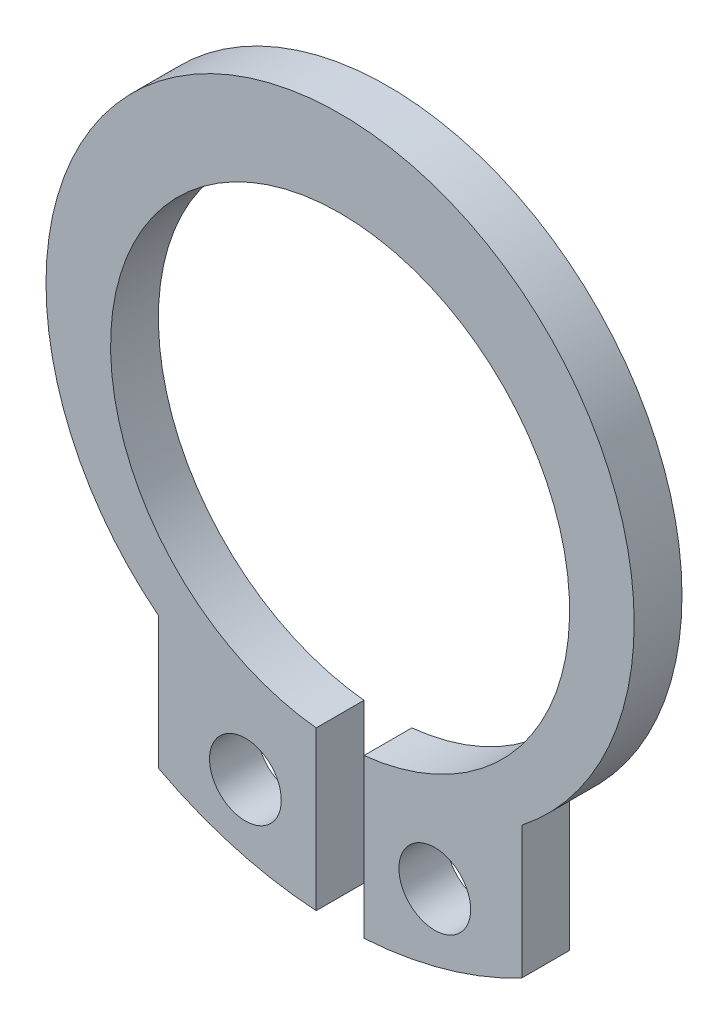
ISO-10303-21;
HEADER;
FILE_DESCRIPTION(('STEP AP214'),'2;1');
FILE_NAME('part.step','',(''),(''),'','','');
FILE_SCHEMA(('AUTOMOTIVE_DESIGN { 1 0 10303 214 1 1 1 1 }'));
ENDSEC;
DATA;
#1=APPLICATION_CONTEXT('core data for automotive mechanical design processes');
#2=APPLICATION_PROTOCOL_DEFINITION('international standard','automotive_design',2000,#1);
#3=PRODUCT_CONTEXT('',#1,'mechanical');
#4=PRODUCT('Part','Part','',(#3));
#5=PRODUCT_RELATED_PRODUCT_CATEGORY('part','',(#4));
#6=PRODUCT_DEFINITION_FORMATION('','',#4);
#7=PRODUCT_DEFINITION_CONTEXT('part definition',#1,'design');
#8=PRODUCT_DEFINITION('design','',#6,#7);
#9=PRODUCT_DEFINITION_SHAPE('','',#8);
#10=(LENGTH_UNIT() NAMED_UNIT(*) SI_UNIT(.MILLI.,.METRE.));
#11=(NAMED_UNIT(*) PLANE_ANGLE_UNIT() SI_UNIT($,.RADIAN.));
#12=(NAMED_UNIT(*) SI_UNIT($,.STERADIAN.) SOLID_ANGLE_UNIT());
#13=UNCERTAINTY_MEASURE_WITH_UNIT(LENGTH_MEASURE(1.E-05),#10,'distance_accuracy_value','');
#14=(GEOMETRIC_REPRESENTATION_CONTEXT(3) GLOBAL_UNCERTAINTY_ASSIGNED_CONTEXT((#13)) GLOBAL_UNIT_ASSIGNED_CONTEXT((#10,
#11,#12)) REPRESENTATION_CONTEXT('',''));
#15=CARTESIAN_POINT('',(0.,0.,0.));
#16=DIRECTION('',(0.,0.,1.));
#17=DIRECTION('',(1.,0.,0.));
#18=AXIS2_PLACEMENT_3D('',#15,#16,#17);
#19=CARTESIAN_POINT('',(-0.5,-8.0845531725631,12.5));
#20=DIRECTION('',(-1.,0.,0.));
#21=DIRECTION('',(0.,-1.,0.));
#22=AXIS2_PLACEMENT_3D('',#19,#20,#21);
#23=PLANE('',#22);
#24=DIRECTION('',(0.,1.,0.));
#25=VECTOR('',#24,1.);
#26=CARTESIAN_POINT('',(-0.5,-8.0845531725631,11.5));
#27=LINE('',#26,#25);
#28=CARTESIAN_POINT('',(-0.500000000000007,-8.0845531725631,11.5));
#29=VERTEX_POINT('',#28);
#30=CARTESIAN_POINT('',(-0.5,-4.773887304912,11.5));
#31=VERTEX_POINT('',#30);
#32=EDGE_CURVE('E103',#29,#31,#27,.T.);
#33=ORIENTED_EDGE('',*,*,#32,.T.);
#34=DIRECTION('',(0.,0.,-1.));
#35=VECTOR('',#34,1.);
#36=CARTESIAN_POINT('',(-0.5,-4.773887304912,12.5));
#37=LINE('',#36,#35);
#38=CARTESIAN_POINT('',(-0.5,-4.773887304912,12.5));
#39=VERTEX_POINT('',#38);
#40=EDGE_CURVE('E11',#39,#31,#37,.T.);
#41=ORIENTED_EDGE('',*,*,#40,.F.);
#42=DIRECTION('',(0.,1.,0.));
#43=VECTOR('',#42,1.);
#44=CARTESIAN_POINT('',(-0.5,-8.0845531725631,12.5));
#45=LINE('',#44,#43);
#46=CARTESIAN_POINT('',(-0.500000000000007,-8.0845531725631,12.5));
#47=VERTEX_POINT('',#46);
#48=EDGE_CURVE('E133',#47,#39,#45,.T.);
#49=ORIENTED_EDGE('',*,*,#48,.F.);
#50=DIRECTION('',(0.,0.,-1.));
#51=VECTOR('',#50,1.);
#52=CARTESIAN_POINT('',(-0.500000000000007,-8.0845531725631,12.5));
#53=LINE('',#52,#51);
#54=EDGE_CURVE('E155',#47,#29,#53,.T.);
#55=ORIENTED_EDGE('',*,*,#54,.T.);
#56=EDGE_LOOP('',(#33,#41,#49,#55));
#57=FACE_BOUND('',#56,.T.);
#58=ADVANCED_FACE('F16',(#57),#23,.F.);
#59=CARTESIAN_POINT('',(0.,0.,12.5));
#60=DIRECTION('',(0.,0.,-1.));
#61=DIRECTION('',(-1.,0.,0.));
#62=AXIS2_PLACEMENT_3D('',#59,#60,#61);
#63=CYLINDRICAL_SURFACE('',#62,4.8);
#64=CARTESIAN_POINT('',(0.,0.,11.5));
#65=DIRECTION('',(0.,0.,1.));
#66=DIRECTION('',(1.,0.,0.));
#67=AXIS2_PLACEMENT_3D('',#64,#65,#66);
#68=CIRCLE('',#67,4.8);
#69=CARTESIAN_POINT('',(0.5,-4.77388730491201,11.5));
#70=VERTEX_POINT('',#69);
#71=EDGE_CURVE('E96',#70,#31,#68,.T.);
#72=ORIENTED_EDGE('',*,*,#71,.F.);
#73=DIRECTION('',(0.,0.,-1.));
#74=VECTOR('',#73,1.);
#75=CARTESIAN_POINT('',(0.5,-4.77388730491201,12.5));
#76=LINE('',#75,#74);
#77=CARTESIAN_POINT('',(0.5,-4.77388730491201,12.5));
#78=VERTEX_POINT('',#77);
#79=EDGE_CURVE('E25',#78,#70,#76,.T.);
#80=ORIENTED_EDGE('',*,*,#79,.F.);
#81=CARTESIAN_POINT('',(0.,0.,12.5));
#82=DIRECTION('',(0.,0.,1.));
#83=DIRECTION('',(1.,0.,0.));
#84=AXIS2_PLACEMENT_3D('',#81,#82,#83);
#85=CIRCLE('',#84,4.8);
#86=EDGE_CURVE('E137',#78,#39,#85,.T.);
#87=ORIENTED_EDGE('',*,*,#86,.T.);
#88=ORIENTED_EDGE('',*,*,#40,.T.);
#89=EDGE_LOOP('',(#72,#80,#87,#88));
#90=FACE_BOUND('',#89,.T.);
#91=ADVANCED_FACE('F97',(#90),#63,.F.);
#92=CARTESIAN_POINT('',(0.5,-8.0845531725631,12.5));
#93=DIRECTION('',(-1.,0.,0.));
#94=DIRECTION('',(0.,-1.,0.));
#95=AXIS2_PLACEMENT_3D('',#92,#93,#94);
#96=PLANE('',#95);
#97=DIRECTION('',(0.,1.,0.));
#98=VECTOR('',#97,1.);
#99=CARTESIAN_POINT('',(0.5,-8.0845531725631,11.5));
#100=LINE('',#99,#98);
#101=CARTESIAN_POINT('',(0.5,-8.0845531725631,11.5));
#102=VERTEX_POINT('',#101);
#103=EDGE_CURVE('E86',#102,#70,#100,.T.);
#104=ORIENTED_EDGE('',*,*,#103,.F.);
#105=DIRECTION('',(0.,0.,-1.));
#106=VECTOR('',#105,1.);
#107=CARTESIAN_POINT('',(0.5,-8.0845531725631,12.5));
#108=LINE('',#107,#106);
#109=CARTESIAN_POINT('',(0.5,-8.0845531725631,12.5));
#110=VERTEX_POINT('',#109);
#111=EDGE_CURVE('E93',#110,#102,#108,.T.);
#112=ORIENTED_EDGE('',*,*,#111,.F.);
#113=DIRECTION('',(0.,1.,0.));
#114=VECTOR('',#113,1.);
#115=CARTESIAN_POINT('',(0.5,-8.0845531725631,12.5));
#116=LINE('',#115,#114);
#117=EDGE_CURVE('E88',#110,#78,#116,.T.);
#118=ORIENTED_EDGE('',*,*,#117,.T.);
#119=ORIENTED_EDGE('',*,*,#79,.T.);
#120=EDGE_LOOP('',(#104,#112,#118,#119));
#121=FACE_BOUND('',#120,.T.);
#122=ADVANCED_FACE('F84',(#121),#96,.T.);
#123=CARTESIAN_POINT('',(0.,0.,12.5));
#124=DIRECTION('',(0.,0.,-1.));
#125=DIRECTION('',(-1.,0.,0.));
#126=AXIS2_PLACEMENT_3D('',#123,#124,#125);
#127=CYLINDRICAL_SURFACE('',#126,8.1);
#128=CARTESIAN_POINT('',(0.,0.,11.5));
#129=DIRECTION('',(0.,0.,1.));
#130=DIRECTION('',(1.,0.,0.));
#131=AXIS2_PLACEMENT_3D('',#128,#129,#130);
#132=CIRCLE('',#131,8.1);
#133=CARTESIAN_POINT('',(3.8,-7.15332090710322,11.5));
#134=VERTEX_POINT('',#133);
#135=EDGE_CURVE('E108',#102,#134,#132,.T.);
#136=ORIENTED_EDGE('',*,*,#135,.T.);
#137=DIRECTION('',(0.,0.,-1.));
#138=VECTOR('',#137,1.);
#139=CARTESIAN_POINT('',(3.8,-7.15332090710322,12.5));
#140=LINE('',#139,#138);
#141=CARTESIAN_POINT('',(3.8,-7.15332090710322,12.5));
#142=VERTEX_POINT('',#141);
#143=EDGE_CURVE('E170',#142,#134,#140,.T.);
#144=ORIENTED_EDGE('',*,*,#143,.F.);
#145=CARTESIAN_POINT('',(0.,0.,12.5));
#146=DIRECTION('',(0.,0.,1.));
#147=DIRECTION('',(1.,0.,0.));
#148=AXIS2_PLACEMENT_3D('',#145,#146,#147);
#149=CIRCLE('',#148,8.1);
#150=EDGE_CURVE('E141',#110,#142,#149,.T.);
#151=ORIENTED_EDGE('',*,*,#150,.F.);
#152=ORIENTED_EDGE('',*,*,#111,.T.);
#153=EDGE_LOOP('',(#136,#144,#151,#152));
#154=FACE_BOUND('',#153,.T.);
#155=ADVANCED_FACE('F226',(#154),#127,.T.);
#156=CARTESIAN_POINT('',(3.8,-7.15332090710322,12.5));
#157=DIRECTION('',(-1.,0.,0.));
#158=DIRECTION('',(0.,0.,1.));
#159=AXIS2_PLACEMENT_3D('',#156,#157,#158);
#160=PLANE('',#159);
#161=DIRECTION('',(0.,1.,0.));
#162=VECTOR('',#161,1.);
#163=CARTESIAN_POINT('',(3.8,-7.15332090710322,11.5));
#164=LINE('',#163,#162);
#165=CARTESIAN_POINT('',(3.8,-4.38554547078197,11.5));
#166=VERTEX_POINT('',#165);
#167=EDGE_CURVE('E116',#134,#166,#164,.T.);
#168=ORIENTED_EDGE('',*,*,#167,.T.);
#169=DIRECTION('',(0.,0.,-1.));
#170=VECTOR('',#169,1.);
#171=CARTESIAN_POINT('',(3.8,-4.38554547078197,12.5));
#172=LINE('',#171,#170);
#173=CARTESIAN_POINT('',(3.8,-4.38554547078197,12.5));
#174=VERTEX_POINT('',#173);
#175=EDGE_CURVE('E166',#174,#166,#172,.T.);
#176=ORIENTED_EDGE('',*,*,#175,.F.);
#177=DIRECTION('',(0.,1.,0.));
#178=VECTOR('',#177,1.);
#179=CARTESIAN_POINT('',(3.8,-7.15332090710322,12.5));
#180=LINE('',#179,#178);
#181=EDGE_CURVE('E144',#142,#174,#180,.T.);
#182=ORIENTED_EDGE('',*,*,#181,.F.);
#183=ORIENTED_EDGE('',*,*,#143,.T.);
#184=EDGE_LOOP('',(#168,#176,#182,#183));
#185=FACE_BOUND('',#184,.T.);
#186=ADVANCED_FACE('F221',(#185),#160,.F.);
#187=CARTESIAN_POINT('',(0.,0.45,12.5));
#188=DIRECTION('',(0.,0.,-1.));
#189=DIRECTION('',(-1.,0.,0.));
#190=AXIS2_PLACEMENT_3D('',#187,#188,#189);
#191=CYLINDRICAL_SURFACE('',#190,6.15);
#192=CARTESIAN_POINT('',(0.,0.45,11.5));
#193=DIRECTION('',(0.,0.,1.));
#194=DIRECTION('',(1.,0.,0.));
#195=AXIS2_PLACEMENT_3D('',#192,#193,#194);
#196=CIRCLE('',#195,6.15);
#197=CARTESIAN_POINT('',(-3.8,-4.38554547078197,11.5));
#198=VERTEX_POINT('',#197);
#199=EDGE_CURVE('E122',#166,#198,#196,.T.);
#200=ORIENTED_EDGE('',*,*,#199,.T.);
#201=DIRECTION('',(0.,0.,-1.));
#202=VECTOR('',#201,1.);
#203=CARTESIAN_POINT('',(-3.8,-4.38554547078197,12.5));
#204=LINE('',#203,#202);
#205=CARTESIAN_POINT('',(-3.8,-4.38554547078197,12.5));
#206=VERTEX_POINT('',#205);
#207=EDGE_CURVE('E163',#206,#198,#204,.T.);
#208=ORIENTED_EDGE('',*,*,#207,.F.);
#209=CARTESIAN_POINT('',(0.,0.45,12.5));
#210=DIRECTION('',(0.,0.,1.));
#211=DIRECTION('',(1.,0.,0.));
#212=AXIS2_PLACEMENT_3D('',#209,#210,#211);
#213=CIRCLE('',#212,6.15);
#214=EDGE_CURVE('E147',#174,#206,#213,.T.);
#215=ORIENTED_EDGE('',*,*,#214,.F.);
#216=ORIENTED_EDGE('',*,*,#175,.T.);
#217=EDGE_LOOP('',(#200,#208,#215,#216));
#218=FACE_BOUND('',#217,.T.);
#219=ADVANCED_FACE('F218',(#218),#191,.T.);
#220=CARTESIAN_POINT('',(-3.8,-7.15332090710322,12.5));
#221=DIRECTION('',(-1.,0.,0.));
#222=DIRECTION('',(0.,0.,1.));
#223=AXIS2_PLACEMENT_3D('',#220,#221,#222);
#224=PLANE('',#223);
#225=DIRECTION('',(0.,1.,0.));
#226=VECTOR('',#225,1.);
#227=CARTESIAN_POINT('',(-3.8,-7.15332090710322,11.5));
#228=LINE('',#227,#226);
#229=CARTESIAN_POINT('',(-3.8,-7.15332090710322,11.5));
#230=VERTEX_POINT('',#229);
#231=EDGE_CURVE('E126',#230,#198,#228,.T.);
#232=ORIENTED_EDGE('',*,*,#231,.F.);
#233=DIRECTION('',(0.,0.,-1.));
#234=VECTOR('',#233,1.);
#235=CARTESIAN_POINT('',(-3.8,-7.15332090710322,12.5));
#236=LINE('',#235,#234);
#237=CARTESIAN_POINT('',(-3.8,-7.15332090710322,12.5));
#238=VERTEX_POINT('',#237);
#239=EDGE_CURVE('E41',#238,#230,#236,.T.);
#240=ORIENTED_EDGE('',*,*,#239,.F.);
#241=DIRECTION('',(0.,1.,0.));
#242=VECTOR('',#241,1.);
#243=CARTESIAN_POINT('',(-3.8,-7.15332090710322,12.5));
#244=LINE('',#243,#242);
#245=EDGE_CURVE('E150',#238,#206,#244,.T.);
#246=ORIENTED_EDGE('',*,*,#245,.T.);
#247=ORIENTED_EDGE('',*,*,#207,.T.);
#248=EDGE_LOOP('',(#232,#240,#246,#247));
#249=FACE_BOUND('',#248,.T.);
#250=ADVANCED_FACE('F214',(#249),#224,.T.);
#251=CARTESIAN_POINT('',(0.,0.,12.5));
#252=DIRECTION('',(0.,0.,-1.));
#253=DIRECTION('',(-1.,0.,0.));
#254=AXIS2_PLACEMENT_3D('',#251,#252,#253);
#255=CYLINDRICAL_SURFACE('',#254,8.1);
#256=CARTESIAN_POINT('',(0.,0.,11.5));
#257=DIRECTION('',(0.,0.,1.));
#258=DIRECTION('',(1.,0.,0.));
#259=AXIS2_PLACEMENT_3D('',#256,#257,#258);
#260=CIRCLE('',#259,8.1);
#261=EDGE_CURVE('E130',#230,#29,#260,.T.);
#262=ORIENTED_EDGE('',*,*,#261,.T.);
#263=ORIENTED_EDGE('',*,*,#54,.F.);
#264=CARTESIAN_POINT('',(0.,0.,12.5));
#265=DIRECTION('',(0.,0.,1.));
#266=DIRECTION('',(1.,0.,0.));
#267=AXIS2_PLACEMENT_3D('',#264,#265,#266);
#268=CIRCLE('',#267,8.1);
#269=EDGE_CURVE('E33',#238,#47,#268,.T.);
#270=ORIENTED_EDGE('',*,*,#269,.F.);
#271=ORIENTED_EDGE('',*,*,#239,.T.);
#272=EDGE_LOOP('',(#262,#263,#270,#271));
#273=FACE_BOUND('',#272,.T.);
#274=ADVANCED_FACE('F229',(#273),#255,.T.);
#275=CARTESIAN_POINT('',(0.,0.,12.5));
#276=DIRECTION('',(0.,0.,1.));
#277=DIRECTION('',(1.,0.,0.));
#278=AXIS2_PLACEMENT_3D('',#275,#276,#277);
#279=PLANE('',#278);
#280=CARTESIAN_POINT('',(1.98,-6.45,12.5));
#281=DIRECTION('',(0.,0.,1.));
#282=DIRECTION('',(1.,0.,0.));
#283=AXIS2_PLACEMENT_3D('',#280,#281,#282);
#284=CIRCLE('',#283,0.75);
#285=CARTESIAN_POINT('',(2.73,-6.45,12.5));
#286=VERTEX_POINT('',#285);
#287=EDGE_CURVE('E177',#286,#286,#284,.T.);
#288=ORIENTED_EDGE('',*,*,#287,.F.);
#289=EDGE_LOOP('',(#288));
#290=FACE_BOUND('',#289,.T.);
#291=CARTESIAN_POINT('',(-1.98,-6.45,12.5));
#292=DIRECTION('',(0.,0.,1.));
#293=DIRECTION('',(1.,0.,0.));
#294=AXIS2_PLACEMENT_3D('',#291,#292,#293);
#295=CIRCLE('',#294,0.75);
#296=CARTESIAN_POINT('',(-1.23,-6.45,12.5));
#297=VERTEX_POINT('',#296);
#298=EDGE_CURVE('E136',#297,#297,#295,.T.);
#299=ORIENTED_EDGE('',*,*,#298,.F.);
#300=EDGE_LOOP('',(#299));
#301=FACE_BOUND('',#300,.T.);
#302=ORIENTED_EDGE('',*,*,#48,.T.);
#303=ORIENTED_EDGE('',*,*,#86,.F.);
#304=ORIENTED_EDGE('',*,*,#117,.F.);
#305=ORIENTED_EDGE('',*,*,#150,.T.);
#306=ORIENTED_EDGE('',*,*,#181,.T.);
#307=ORIENTED_EDGE('',*,*,#214,.T.);
#308=ORIENTED_EDGE('',*,*,#245,.F.);
#309=ORIENTED_EDGE('',*,*,#269,.T.);
#310=EDGE_LOOP('',(#302,#303,#304,#305,#306,#307,#308,#309));
#311=FACE_BOUND('',#310,.T.);
#312=ADVANCED_FACE('F227',(#290,#301,#311),#279,.T.);
#313=CARTESIAN_POINT('',(0.,0.,11.5));
#314=DIRECTION('',(0.,0.,1.));
#315=DIRECTION('',(1.,0.,0.));
#316=AXIS2_PLACEMENT_3D('',#313,#314,#315);
#317=PLANE('',#316);
#318=CARTESIAN_POINT('',(1.98,-6.45,11.5));
#319=DIRECTION('',(0.,0.,1.));
#320=DIRECTION('',(1.,0.,0.));
#321=AXIS2_PLACEMENT_3D('',#318,#319,#320);
#322=CIRCLE('',#321,0.75);
#323=CARTESIAN_POINT('',(2.73,-6.45,11.5));
#324=VERTEX_POINT('',#323);
#325=EDGE_CURVE('E19',#324,#324,#322,.T.);
#326=ORIENTED_EDGE('',*,*,#325,.T.);
#327=EDGE_LOOP('',(#326));
#328=FACE_BOUND('',#327,.T.);
#329=CARTESIAN_POINT('',(-1.98,-6.45,11.5));
#330=DIRECTION('',(0.,0.,1.));
#331=DIRECTION('',(1.,0.,0.));
#332=AXIS2_PLACEMENT_3D('',#329,#330,#331);
#333=CIRCLE('',#332,0.75);
#334=CARTESIAN_POINT('',(-1.23,-6.45,11.5));
#335=VERTEX_POINT('',#334);
#336=EDGE_CURVE('E174',#335,#335,#333,.T.);
#337=ORIENTED_EDGE('',*,*,#336,.T.);
#338=EDGE_LOOP('',(#337));
#339=FACE_BOUND('',#338,.T.);
#340=ORIENTED_EDGE('',*,*,#32,.F.);
#341=ORIENTED_EDGE('',*,*,#261,.F.);
#342=ORIENTED_EDGE('',*,*,#231,.T.);
#343=ORIENTED_EDGE('',*,*,#199,.F.);
#344=ORIENTED_EDGE('',*,*,#167,.F.);
#345=ORIENTED_EDGE('',*,*,#135,.F.);
#346=ORIENTED_EDGE('',*,*,#103,.T.);
#347=ORIENTED_EDGE('',*,*,#71,.T.);
#348=EDGE_LOOP('',(#340,#341,#342,#343,#344,#345,#346,#347));
#349=FACE_BOUND('',#348,.T.);
#350=ADVANCED_FACE('F106',(#328,#339,#349),#317,.F.);
#351=CARTESIAN_POINT('',(-1.98,-6.45,10.5));
#352=DIRECTION('',(0.,0.,1.));
#353=DIRECTION('',(0.,1.,0.));
#354=AXIS2_PLACEMENT_3D('',#351,#352,#353);
#355=CYLINDRICAL_SURFACE('',#354,0.75);
#356=ORIENTED_EDGE('',*,*,#298,.T.);
#357=EDGE_LOOP('',(#356));
#358=FACE_BOUND('',#357,.T.);
#359=ORIENTED_EDGE('',*,*,#336,.F.);
#360=EDGE_LOOP('',(#359));
#361=FACE_BOUND('',#360,.T.);
#362=ADVANCED_FACE('F197',(#358,#361),#355,.F.);
#363=CARTESIAN_POINT('',(1.98,-6.45,10.5));
#364=DIRECTION('',(0.,0.,1.));
#365=DIRECTION('',(0.,1.,0.));
#366=AXIS2_PLACEMENT_3D('',#363,#364,#365);
#367=CYLINDRICAL_SURFACE('',#366,0.75);
#368=ORIENTED_EDGE('',*,*,#287,.T.);
#369=EDGE_LOOP('',(#368));
#370=FACE_BOUND('',#369,.T.);
#371=ORIENTED_EDGE('',*,*,#325,.F.);
#372=EDGE_LOOP('',(#371));
#373=FACE_BOUND('',#372,.T.);
#374=ADVANCED_FACE('F195',(#370,#373),#367,.F.);
#375=CLOSED_SHELL('',(#58,#91,#122,#155,#186,#219,#250,#274,#312,#350,#362,#374));
#376=MANIFOLD_SOLID_BREP('B1',#375);
#377=ADVANCED_BREP_SHAPE_REPRESENTATION('',(#18,#376),#14);
#378=SHAPE_DEFINITION_REPRESENTATION(#9,#377);
ENDSEC;
END-ISO-10303-21;
